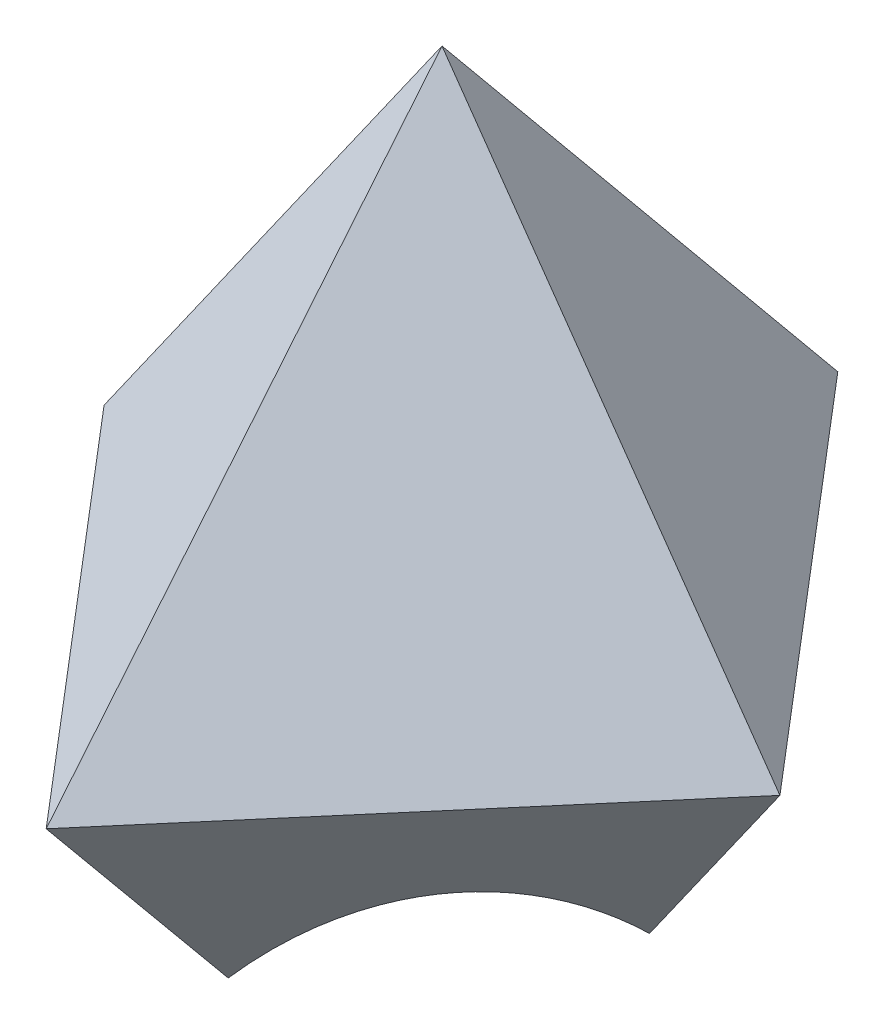
ISO-10303-21;
HEADER;
FILE_DESCRIPTION(('STEP AP214'),'2;1');
FILE_NAME('part.step','',(''),(''),'','','');
FILE_SCHEMA(('AUTOMOTIVE_DESIGN { 1 0 10303 214 1 1 1 1 }'));
ENDSEC;
DATA;
#1=APPLICATION_CONTEXT('core data for automotive mechanical design processes');
#2=APPLICATION_PROTOCOL_DEFINITION('international standard','automotive_design',2000,#1);
#3=PRODUCT_CONTEXT('',#1,'mechanical');
#4=PRODUCT('Part','Part','',(#3));
#5=PRODUCT_RELATED_PRODUCT_CATEGORY('part','',(#4));
#6=PRODUCT_DEFINITION_FORMATION('','',#4);
#7=PRODUCT_DEFINITION_CONTEXT('part definition',#1,'design');
#8=PRODUCT_DEFINITION('design','',#6,#7);
#9=PRODUCT_DEFINITION_SHAPE('','',#8);
#10=(LENGTH_UNIT() NAMED_UNIT(*) SI_UNIT(.MILLI.,.METRE.));
#11=(NAMED_UNIT(*) PLANE_ANGLE_UNIT() SI_UNIT($,.RADIAN.));
#12=(NAMED_UNIT(*) SI_UNIT($,.STERADIAN.) SOLID_ANGLE_UNIT());
#13=UNCERTAINTY_MEASURE_WITH_UNIT(LENGTH_MEASURE(1.E-05),#10,'distance_accuracy_value','');
#14=(GEOMETRIC_REPRESENTATION_CONTEXT(3) GLOBAL_UNCERTAINTY_ASSIGNED_CONTEXT((#13)) GLOBAL_UNIT_ASSIGNED_CONTEXT((#10,
#11,#12)) REPRESENTATION_CONTEXT('',''));
#15=CARTESIAN_POINT('',(0.,0.,0.));
#16=DIRECTION('',(0.,0.,1.));
#17=DIRECTION('',(1.,0.,0.));
#18=AXIS2_PLACEMENT_3D('',#15,#16,#17);
#19=CARTESIAN_POINT('',(50.4900645916166,35.6247262847005,-43.1059188044878));
#20=DIRECTION('',(-0.670140807989291,-0.472837241344915,0.572133062027349));
#21=DIRECTION('',(0.649302844893451,0.,0.760529957078136));
#22=AXIS2_PLACEMENT_3D('',#19,#20,#21);
#23=PLANE('',#22);
#24=DIRECTION('',(-0.57651771920326,0.817084646437975,0.));
#25=VECTOR('',#24,1.);
#26=CARTESIAN_POINT('',(115.627831307557,-4.53529631951044,0.));
#27=LINE('',#26,#25);
#28=CARTESIAN_POINT('',(102.309884640336,14.3399080001498,1.0816203827391E-13));
#29=VERTEX_POINT('',#28);
#30=CARTESIAN_POINT('',(93.9425681475696,26.1987036804895,1.59176532930695E-13));
#31=VERTEX_POINT('',#30);
#32=EDGE_CURVE('E41',#29,#31,#27,.T.);
#33=ORIENTED_EDGE('',*,*,#32,.F.);
#34=CARTESIAN_POINT('',(120.303863156465,-15.9930425633477,-3.99216461370301));
#35=DIRECTION('',(-0.670140807989291,-0.472837241344915,0.572133062027349));
#36=DIRECTION('',(0.359606886864992,-0.881149784768362,-0.307014565976825));
#37=AXIS2_PLACEMENT_3D('',#34,#35,#36);
#38=ELLIPSE('',#37,39.4986844137864,17.6353932238463);
#39=CARTESIAN_POINT('',(115.627831307557,12.0655682398152,13.7197227763021));
#40=VERTEX_POINT('',#39);
#41=EDGE_CURVE('E101',#29,#40,#38,.F.);
#42=ORIENTED_EDGE('',*,*,#41,.T.);
#43=DIRECTION('',(0.,-0.770825735452114,-0.637046062357117));
#44=VECTOR('',#43,1.);
#45=CARTESIAN_POINT('',(115.627831307557,7.93741176863529,10.3080232133435));
#46=LINE('',#45,#44);
#47=CARTESIAN_POINT('',(115.627831307557,26.1987036804895,25.3999999999999));
#48=VERTEX_POINT('',#47);
#49=EDGE_CURVE('E90',#48,#40,#46,.T.);
#50=ORIENTED_EDGE('',*,*,#49,.F.);
#51=DIRECTION('',(0.649302844893448,0.,0.760529957078139));
#52=VECTOR('',#51,1.);
#53=CARTESIAN_POINT('',(106.485450472411,26.1987036804895,14.6915077165772));
#54=LINE('',#53,#52);
#55=EDGE_CURVE('E119',#31,#48,#54,.T.);
#56=ORIENTED_EDGE('',*,*,#55,.F.);
#57=EDGE_LOOP('',(#33,#42,#50,#56));
#58=FACE_BOUND('',#57,.T.);
#59=ADVANCED_FACE('F33',(#58),#23,.T.);
#60=CARTESIAN_POINT('',(50.4900645916172,35.6247262847006,43.1059188044878));
#61=DIRECTION('',(0.670140807989296,0.472837241344913,0.572133062027346));
#62=DIRECTION('',(0.649302844893446,0.,-0.76052995707814));
#63=AXIS2_PLACEMENT_3D('',#60,#61,#62);
#64=PLANE('',#63);
#65=CARTESIAN_POINT('',(120.303863156465,-15.9930425633479,3.99216461370296));
#66=DIRECTION('',(0.670140807989296,0.472837241344913,0.572133062027346));
#67=DIRECTION('',(0.359606886864993,-0.881149784768363,0.307014565976821));
#68=AXIS2_PLACEMENT_3D('',#65,#66,#67);
#69=ELLIPSE('',#68,39.4986844137867,17.6353932238463);
#70=CARTESIAN_POINT('',(115.627831307557,12.0655682398152,-13.7197227763021));
#71=VERTEX_POINT('',#70);
#72=EDGE_CURVE('E47',#29,#71,#69,.F.);
#73=ORIENTED_EDGE('',*,*,#72,.F.);
#74=ORIENTED_EDGE('',*,*,#32,.T.);
#75=DIRECTION('',(-0.649302844893446,0.,0.76052995707814));
#76=VECTOR('',#75,1.);
#77=CARTESIAN_POINT('',(81.3996858227285,26.1987036804895,14.6915077165773));
#78=LINE('',#77,#76);
#79=CARTESIAN_POINT('',(115.627831307557,26.1987036804895,-25.4));
#80=VERTEX_POINT('',#79);
#81=EDGE_CURVE('E106',#80,#31,#78,.T.);
#82=ORIENTED_EDGE('',*,*,#81,.F.);
#83=DIRECTION('',(0.,-0.770825735452114,0.637046062357117));
#84=VECTOR('',#83,1.);
#85=CARTESIAN_POINT('',(115.627831307557,-17.0080044076562,10.3080232133436));
#86=LINE('',#85,#84);
#87=EDGE_CURVE('E96',#80,#71,#86,.T.);
#88=ORIENTED_EDGE('',*,*,#87,.T.);
#89=EDGE_LOOP('',(#73,#74,#82,#88));
#90=FACE_BOUND('',#89,.T.);
#91=ADVANCED_FACE('F125',(#90),#64,.F.);
#92=CARTESIAN_POINT('',(53.3642408855084,-37.6526845492034,45.5597483045366));
#93=DIRECTION('',(-0.670140807989293,0.472837241344912,-0.57213306202735));
#94=DIRECTION('',(-0.64930284489345,0.,0.760529957078137));
#95=AXIS2_PLACEMENT_3D('',#92,#93,#94);
#96=PLANE('',#95);
#97=CARTESIAN_POINT('',(110.951799458649,-15.993042563348,-3.99216461370306));
#98=DIRECTION('',(-0.670140807989293,0.472837241344912,-0.57213306202735));
#99=DIRECTION('',(-0.35960688686499,-0.881149784768364,-0.307014565976822));
#100=AXIS2_PLACEMENT_3D('',#97,#98,#99);
#101=ELLIPSE('',#100,39.4986844137869,17.6353932238464);
#102=CARTESIAN_POINT('',(128.945777974778,14.3399080001497,0.));
#103=VERTEX_POINT('',#102);
#104=EDGE_CURVE('E78',#103,#40,#101,.F.);
#105=ORIENTED_EDGE('',*,*,#104,.F.);
#106=DIRECTION('',(-0.57651771920326,-0.817084646437975,0.));
#107=VECTOR('',#106,1.);
#108=CARTESIAN_POINT('',(77.1962990690652,-59.0033792338656,2.61406148965882E-13));
#109=LINE('',#108,#107);
#110=CARTESIAN_POINT('',(137.313094467545,26.1987036804894,-1.04083407989078E-13));
#111=VERTEX_POINT('',#110);
#112=EDGE_CURVE('E87',#111,#103,#109,.T.);
#113=ORIENTED_EDGE('',*,*,#112,.F.);
#114=DIRECTION('',(0.649302844893448,0.,-0.760529957078139));
#115=VECTOR('',#114,1.);
#116=CARTESIAN_POINT('',(106.485450472411,26.1987036804895,36.1084922834228));
#117=LINE('',#116,#115);
#118=EDGE_CURVE('E111',#48,#111,#117,.T.);
#119=ORIENTED_EDGE('',*,*,#118,.F.);
#120=ORIENTED_EDGE('',*,*,#49,.T.);
#121=EDGE_LOOP('',(#105,#113,#119,#120));
#122=FACE_BOUND('',#121,.T.);
#123=ADVANCED_FACE('F86',(#122),#96,.F.);
#124=CARTESIAN_POINT('',(53.3642408855086,-37.6526845492036,-45.5597483045365));
#125=DIRECTION('',(-0.670140807989294,0.472837241344913,0.572133062027347));
#126=DIRECTION('',(0.649302844893448,0.,0.760529957078138));
#127=AXIS2_PLACEMENT_3D('',#124,#125,#126);
#128=PLANE('',#127);
#129=CARTESIAN_POINT('',(110.951799458649,-15.9930425633478,3.99216461370296));
#130=DIRECTION('',(-0.670140807989294,0.472837241344913,0.572133062027347));
#131=DIRECTION('',(-0.359606886864992,-0.881149784768363,0.307014565976822));
#132=AXIS2_PLACEMENT_3D('',#129,#130,#131);
#133=ELLIPSE('',#132,39.4986844137866,17.6353932238463);
#134=EDGE_CURVE('E11',#71,#103,#133,.F.);
#135=ORIENTED_EDGE('',*,*,#134,.F.);
#136=ORIENTED_EDGE('',*,*,#87,.F.);
#137=DIRECTION('',(-0.649302844893447,0.,-0.760529957078139));
#138=VECTOR('',#137,1.);
#139=CARTESIAN_POINT('',(131.571215122093,26.1987036804895,-6.72547685026844));
#140=LINE('',#139,#138);
#141=EDGE_CURVE('E95',#111,#80,#140,.T.);
#142=ORIENTED_EDGE('',*,*,#141,.F.);
#143=ORIENTED_EDGE('',*,*,#112,.T.);
#144=EDGE_LOOP('',(#135,#136,#142,#143));
#145=FACE_BOUND('',#144,.T.);
#146=ADVANCED_FACE('F93',(#145),#128,.F.);
#147=CARTESIAN_POINT('',(33.9395274948414,-23.8934273563684,-28.975889183121));
#148=DIRECTION('',(-0.670475965611686,0.472015079790627,0.572419203021112));
#149=DIRECTION('',(0.649302844893448,0.,0.760529957078139));
#150=AXIS2_PLACEMENT_3D('',#147,#148,#149);
#151=PLANE('',#150);
#152=ORIENTED_EDGE('',*,*,#55,.T.);
#153=DIRECTION('',(0.,0.771525937369041,-0.636197868565137));
#154=VECTOR('',#153,1.);
#155=CARTESIAN_POINT('',(115.627831307557,26.1987036804895,25.4));
#156=LINE('',#155,#154);
#157=CARTESIAN_POINT('',(115.627831307557,57.001634305472,0.));
#158=VERTEX_POINT('',#157);
#159=EDGE_CURVE('E116',#48,#158,#156,.T.);
#160=ORIENTED_EDGE('',*,*,#159,.T.);
#161=DIRECTION('',(-0.575655433000418,-0.817692376421048,0.));
#162=VECTOR('',#161,1.);
#163=CARTESIAN_POINT('',(115.627831307557,57.001634305472,0.));
#164=LINE('',#163,#162);
#165=EDGE_CURVE('E55',#158,#31,#164,.T.);
#166=ORIENTED_EDGE('',*,*,#165,.T.);
#167=EDGE_LOOP('',(#152,#160,#166));
#168=FACE_BOUND('',#167,.T.);
#169=ADVANCED_FACE('F35',(#168),#151,.T.);
#170=CARTESIAN_POINT('',(197.316135120273,-23.8934273563684,-28.975889183121));
#171=DIRECTION('',(0.670475965611686,0.472015079790627,0.572419203021112));
#172=DIRECTION('',(-0.649302844893448,0.,0.760529957078139));
#173=AXIS2_PLACEMENT_3D('',#170,#171,#172);
#174=PLANE('',#173);
#175=ORIENTED_EDGE('',*,*,#118,.T.);
#176=DIRECTION('',(0.575655433000418,-0.817692376421048,0.));
#177=VECTOR('',#176,1.);
#178=CARTESIAN_POINT('',(115.627831307557,57.001634305472,0.));
#179=LINE('',#178,#177);
#180=EDGE_CURVE('E114',#158,#111,#179,.T.);
#181=ORIENTED_EDGE('',*,*,#180,.F.);
#182=ORIENTED_EDGE('',*,*,#159,.F.);
#183=EDGE_LOOP('',(#175,#181,#182));
#184=FACE_BOUND('',#183,.T.);
#185=ADVANCED_FACE('F133',(#184),#174,.T.);
#186=CARTESIAN_POINT('',(70.0186852979987,49.2931544497911,-59.77848885053));
#187=DIRECTION('',(0.670475965611686,0.472015079790627,-0.572419203021112));
#188=DIRECTION('',(-0.649302844893447,0.,-0.760529957078139));
#189=AXIS2_PLACEMENT_3D('',#186,#187,#188);
#190=PLANE('',#189);
#191=ORIENTED_EDGE('',*,*,#141,.T.);
#192=DIRECTION('',(0.,-0.771525937369041,-0.636197868565136));
#193=VECTOR('',#192,1.);
#194=CARTESIAN_POINT('',(115.627831307557,44.5342181202907,-10.2805922903574));
#195=LINE('',#194,#193);
#196=EDGE_CURVE('E108',#158,#80,#195,.T.);
#197=ORIENTED_EDGE('',*,*,#196,.F.);
#198=ORIENTED_EDGE('',*,*,#180,.T.);
#199=EDGE_LOOP('',(#191,#197,#198));
#200=FACE_BOUND('',#199,.T.);
#201=ADVANCED_FACE('F135',(#200),#190,.T.);
#202=CARTESIAN_POINT('',(33.9395274948416,-23.8934273563685,28.975889183121));
#203=DIRECTION('',(-0.670475965611687,0.472015079790628,-0.572419203021111));
#204=DIRECTION('',(-0.649302844893446,0.,0.76052995707814));
#205=AXIS2_PLACEMENT_3D('',#202,#203,#204);
#206=PLANE('',#205);
#207=ORIENTED_EDGE('',*,*,#81,.T.);
#208=ORIENTED_EDGE('',*,*,#165,.F.);
#209=ORIENTED_EDGE('',*,*,#196,.T.);
#210=EDGE_LOOP('',(#207,#208,#209));
#211=FACE_BOUND('',#210,.T.);
#212=ADVANCED_FACE('F130',(#211),#206,.T.);
#213=CARTESIAN_POINT('',(128.111480982705,19.0626249017052,0.));
#214=DIRECTION('',(0.,-1.,0.));
#215=DIRECTION('',(0.,0.,1.));
#216=AXIS2_PLACEMENT_3D('',#213,#214,#215);
#217=PLANE('',#216);
#218=CARTESIAN_POINT('',(115.627831307557,19.0626249017052,0.));
#219=DIRECTION('',(0.,1.,0.));
#220=DIRECTION('',(0.,0.,-1.));
#221=AXIS2_PLACEMENT_3D('',#218,#219,#220);
#222=CIRCLE('',#221,4.7625);
#223=CARTESIAN_POINT('',(115.627831307557,19.0626249017052,-4.76250000000003));
#224=VERTEX_POINT('',#223);
#225=EDGE_CURVE('E239',#224,#224,#222,.T.);
#226=ORIENTED_EDGE('',*,*,#225,.T.);
#227=EDGE_LOOP('',(#226));
#228=FACE_BOUND('',#227,.T.);
#229=CARTESIAN_POINT('',(115.627831307557,19.0626249017052,0.));
#230=DIRECTION('',(0.,1.,0.));
#231=DIRECTION('',(0.,0.,-1.));
#232=AXIS2_PLACEMENT_3D('',#229,#230,#231);
#233=CIRCLE('',#232,12.4836496751481);
#234=CARTESIAN_POINT('',(115.627831307557,19.0626249017052,-12.4836496751481));
#235=VERTEX_POINT('',#234);
#236=EDGE_CURVE('E91',#235,#235,#233,.T.);
#237=ORIENTED_EDGE('',*,*,#236,.F.);
#238=EDGE_LOOP('',(#237));
#239=FACE_BOUND('',#238,.T.);
#240=ADVANCED_FACE('F142',(#228,#239),#217,.T.);
#241=CARTESIAN_POINT('',(115.627831307557,-90.8628458489045,0.));
#242=DIRECTION('',(0.,-1.,0.));
#243=DIRECTION('',(0.,0.,1.));
#244=AXIS2_PLACEMENT_3D('',#241,#242,#243);
#245=CONICAL_SURFACE('',#244,31.9026602809341,0.174852152218462);
#246=ORIENTED_EDGE('',*,*,#72,.T.);
#247=ORIENTED_EDGE('',*,*,#134,.T.);
#248=ORIENTED_EDGE('',*,*,#104,.T.);
#249=ORIENTED_EDGE('',*,*,#41,.F.);
#250=EDGE_LOOP('',(#246,#247,#248,#249));
#251=FACE_BOUND('',#250,.T.);
#252=ORIENTED_EDGE('',*,*,#236,.T.);
#253=EDGE_LOOP('',(#252));
#254=FACE_BOUND('',#253,.T.);
#255=ADVANCED_FACE('F76',(#251,#254),#245,.F.);
#256=CARTESIAN_POINT('',(115.627831307557,25.4,0.));
#257=DIRECTION('',(0.,1.,0.));
#258=DIRECTION('',(0.,0.,1.));
#259=AXIS2_PLACEMENT_3D('',#256,#257,#258);
#260=PLANE('',#259);
#261=CARTESIAN_POINT('',(115.627831307557,25.4,0.));
#262=DIRECTION('',(0.,1.,0.));
#263=DIRECTION('',(0.,0.,1.));
#264=AXIS2_PLACEMENT_3D('',#261,#262,#263);
#265=CIRCLE('',#264,4.7625);
#266=CARTESIAN_POINT('',(115.627831307557,25.4,4.76250000000003));
#267=VERTEX_POINT('',#266);
#268=EDGE_CURVE('E97',#267,#267,#265,.T.);
#269=ORIENTED_EDGE('',*,*,#268,.F.);
#270=EDGE_LOOP('',(#269));
#271=FACE_BOUND('',#270,.T.);
#272=ADVANCED_FACE('F159',(#271),#260,.F.);
#273=CARTESIAN_POINT('',(115.627831307557,-30.734,0.));
#274=DIRECTION('',(0.,1.,0.));
#275=DIRECTION('',(0.,0.,1.));
#276=AXIS2_PLACEMENT_3D('',#273,#274,#275);
#277=CYLINDRICAL_SURFACE('',#276,4.7625);
#278=ORIENTED_EDGE('',*,*,#268,.T.);
#279=EDGE_LOOP('',(#278));
#280=FACE_BOUND('',#279,.T.);
#281=ORIENTED_EDGE('',*,*,#225,.F.);
#282=EDGE_LOOP('',(#281));
#283=FACE_BOUND('',#282,.T.);
#284=ADVANCED_FACE('F156',(#280,#283),#277,.F.);
#285=CLOSED_SHELL('',(#59,#91,#123,#146,#169,#185,#201,#212,#240,#255,#272,#284));
#286=MANIFOLD_SOLID_BREP('B2',#285);
#287=ADVANCED_BREP_SHAPE_REPRESENTATION('',(#18,#286),#14);
#288=SHAPE_DEFINITION_REPRESENTATION(#9,#287);
ENDSEC;
END-ISO-10303-21;
